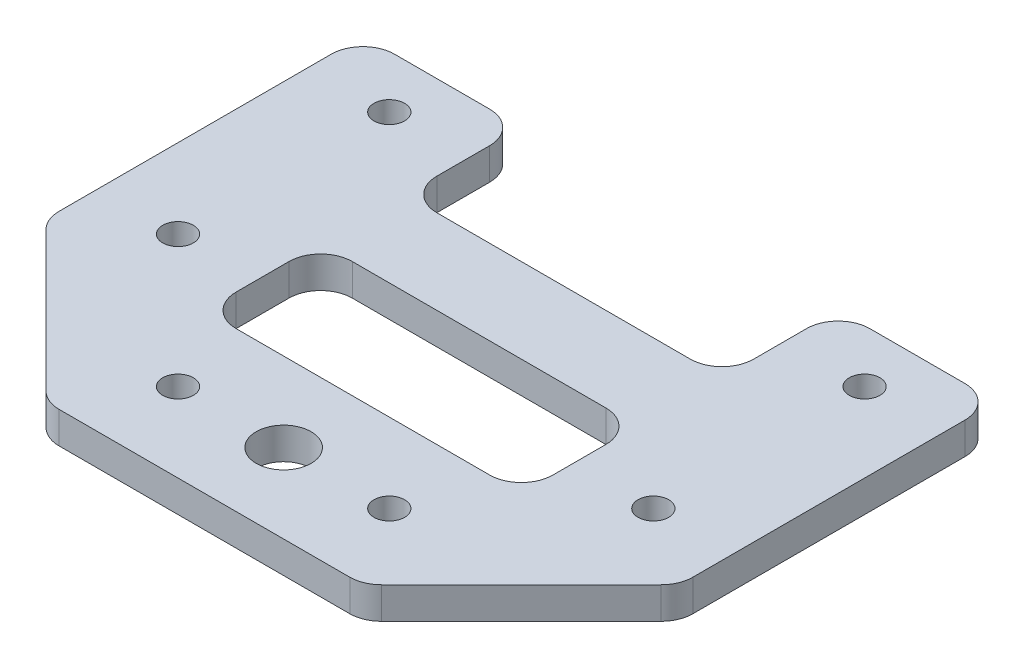
ISO-10303-21;
HEADER;
FILE_DESCRIPTION(('STEP AP214'),'2;1');
FILE_NAME('part.step','',(''),(''),'','','');
FILE_SCHEMA(('AUTOMOTIVE_DESIGN { 1 0 10303 214 1 1 1 1 }'));
ENDSEC;
DATA;
#1=APPLICATION_CONTEXT('core data for automotive mechanical design processes');
#2=APPLICATION_PROTOCOL_DEFINITION('international standard','automotive_design',2000,#1);
#3=PRODUCT_CONTEXT('',#1,'mechanical');
#4=PRODUCT('Part','Part','',(#3));
#5=PRODUCT_RELATED_PRODUCT_CATEGORY('part','',(#4));
#6=PRODUCT_DEFINITION_FORMATION('','',#4);
#7=PRODUCT_DEFINITION_CONTEXT('part definition',#1,'design');
#8=PRODUCT_DEFINITION('design','',#6,#7);
#9=PRODUCT_DEFINITION_SHAPE('','',#8);
#10=(LENGTH_UNIT() NAMED_UNIT(*) SI_UNIT(.MILLI.,.METRE.));
#11=(NAMED_UNIT(*) PLANE_ANGLE_UNIT() SI_UNIT($,.RADIAN.));
#12=(NAMED_UNIT(*) SI_UNIT($,.STERADIAN.) SOLID_ANGLE_UNIT());
#13=UNCERTAINTY_MEASURE_WITH_UNIT(LENGTH_MEASURE(1.E-05),#10,'distance_accuracy_value','');
#14=(GEOMETRIC_REPRESENTATION_CONTEXT(3) GLOBAL_UNCERTAINTY_ASSIGNED_CONTEXT((#13)) GLOBAL_UNIT_ASSIGNED_CONTEXT((#10,
#11,#12)) REPRESENTATION_CONTEXT('',''));
#15=CARTESIAN_POINT('',(0.,0.,0.));
#16=DIRECTION('',(0.,0.,1.));
#17=DIRECTION('',(1.,0.,0.));
#18=AXIS2_PLACEMENT_3D('',#15,#16,#17);
#19=CARTESIAN_POINT('',(0.,3.,0.));
#20=DIRECTION('',(0.,-1.,0.));
#21=DIRECTION('',(0.,0.,-1.));
#22=AXIS2_PLACEMENT_3D('',#19,#20,#21);
#23=PLANE('',#22);
#24=DIRECTION('',(1.,0.,0.));
#25=VECTOR('',#24,1.);
#26=CARTESIAN_POINT('',(0.,3.,15.));
#27=LINE('',#26,#25);
#28=CARTESIAN_POINT('',(-12.,3.,15.));
#29=VERTEX_POINT('',#28);
#30=CARTESIAN_POINT('',(12.,3.,15.));
#31=VERTEX_POINT('',#30);
#32=EDGE_CURVE('E560',#29,#31,#27,.T.);
#33=ORIENTED_EDGE('',*,*,#32,.F.);
#34=CARTESIAN_POINT('',(-12.,3.,12.));
#35=DIRECTION('',(0.,-1.,0.));
#36=DIRECTION('',(0.,0.,-1.));
#37=AXIS2_PLACEMENT_3D('',#34,#35,#36);
#38=CIRCLE('',#37,3.);
#39=CARTESIAN_POINT('',(-15.,3.,12.));
#40=VERTEX_POINT('',#39);
#41=EDGE_CURVE('E240',#29,#40,#38,.T.);
#42=ORIENTED_EDGE('',*,*,#41,.T.);
#43=DIRECTION('',(0.,0.,-1.));
#44=VECTOR('',#43,1.);
#45=CARTESIAN_POINT('',(-15.,3.,-15.));
#46=LINE('',#45,#44);
#47=CARTESIAN_POINT('',(-15.,3.,7.));
#48=VERTEX_POINT('',#47);
#49=EDGE_CURVE('E405',#40,#48,#46,.T.);
#50=ORIENTED_EDGE('',*,*,#49,.T.);
#51=CARTESIAN_POINT('',(-12.,3.,7.));
#52=DIRECTION('',(0.,-1.,0.));
#53=DIRECTION('',(0.,0.,-1.));
#54=AXIS2_PLACEMENT_3D('',#51,#52,#53);
#55=CIRCLE('',#54,3.);
#56=CARTESIAN_POINT('',(-12.,3.,4.));
#57=VERTEX_POINT('',#56);
#58=EDGE_CURVE('E370',#48,#57,#55,.T.);
#59=ORIENTED_EDGE('',*,*,#58,.T.);
#60=DIRECTION('',(1.,0.,0.));
#61=VECTOR('',#60,1.);
#62=CARTESIAN_POINT('',(-15.,3.,4.));
#63=LINE('',#62,#61);
#64=CARTESIAN_POINT('',(12.,3.,4.));
#65=VERTEX_POINT('',#64);
#66=EDGE_CURVE('E236',#57,#65,#63,.T.);
#67=ORIENTED_EDGE('',*,*,#66,.T.);
#68=CARTESIAN_POINT('',(12.,3.,7.));
#69=DIRECTION('',(0.,-1.,0.));
#70=DIRECTION('',(0.,0.,-1.));
#71=AXIS2_PLACEMENT_3D('',#68,#69,#70);
#72=CIRCLE('',#71,3.);
#73=CARTESIAN_POINT('',(15.,3.,7.));
#74=VERTEX_POINT('',#73);
#75=EDGE_CURVE('E230',#65,#74,#72,.T.);
#76=ORIENTED_EDGE('',*,*,#75,.T.);
#77=DIRECTION('',(0.,0.,1.));
#78=VECTOR('',#77,1.);
#79=CARTESIAN_POINT('',(15.,3.,-15.));
#80=LINE('',#79,#78);
#81=CARTESIAN_POINT('',(15.,3.,12.));
#82=VERTEX_POINT('',#81);
#83=EDGE_CURVE('E234',#74,#82,#80,.T.);
#84=ORIENTED_EDGE('',*,*,#83,.T.);
#85=CARTESIAN_POINT('',(12.,3.,12.));
#86=DIRECTION('',(0.,-1.,0.));
#87=DIRECTION('',(0.,0.,-1.));
#88=AXIS2_PLACEMENT_3D('',#85,#86,#87);
#89=CIRCLE('',#88,3.);
#90=EDGE_CURVE('E360',#82,#31,#89,.T.);
#91=ORIENTED_EDGE('',*,*,#90,.T.);
#92=EDGE_LOOP('',(#33,#42,#50,#59,#67,#76,#84,#91));
#93=FACE_BOUND('',#92,.T.);
#94=DIRECTION('',(-0.707106781186556,0.,-0.707106781186539));
#95=VECTOR('',#94,1.);
#96=CARTESIAN_POINT('',(-30.,3.,15.));
#97=LINE('',#96,#95);
#98=CARTESIAN_POINT('',(-15.87867965644,3.,29.1213203435597));
#99=VERTEX_POINT('',#98);
#100=CARTESIAN_POINT('',(-29.1213203435596,3.,15.8786796564404));
#101=VERTEX_POINT('',#100);
#102=EDGE_CURVE('E590',#99,#101,#97,.T.);
#103=ORIENTED_EDGE('',*,*,#102,.F.);
#104=CARTESIAN_POINT('',(-13.7573593128804,3.,27.));
#105=DIRECTION('',(0.,-1.,0.));
#106=DIRECTION('',(0.,0.,-1.));
#107=AXIS2_PLACEMENT_3D('',#104,#105,#106);
#108=CIRCLE('',#107,3.);
#109=CARTESIAN_POINT('',(-13.7573593128804,3.,30.));
#110=VERTEX_POINT('',#109);
#111=EDGE_CURVE('E299',#99,#110,#108,.F.);
#112=ORIENTED_EDGE('',*,*,#111,.T.);
#113=DIRECTION('',(1.,0.,0.));
#114=VECTOR('',#113,1.);
#115=CARTESIAN_POINT('',(0.,3.,30.));
#116=LINE('',#115,#114);
#117=CARTESIAN_POINT('',(13.7573593128804,3.,30.));
#118=VERTEX_POINT('',#117);
#119=EDGE_CURVE('E556',#110,#118,#116,.T.);
#120=ORIENTED_EDGE('',*,*,#119,.T.);
#121=CARTESIAN_POINT('',(13.7573593128804,3.,27.));
#122=DIRECTION('',(0.,-1.,0.));
#123=DIRECTION('',(0.,0.,-1.));
#124=AXIS2_PLACEMENT_3D('',#121,#122,#123);
#125=CIRCLE('',#124,3.);
#126=CARTESIAN_POINT('',(15.87867965644,3.,29.1213203435597));
#127=VERTEX_POINT('',#126);
#128=EDGE_CURVE('E297',#118,#127,#125,.F.);
#129=ORIENTED_EDGE('',*,*,#128,.T.);
#130=DIRECTION('',(-0.707106781186556,0.,0.707106781186539));
#131=VECTOR('',#130,1.);
#132=CARTESIAN_POINT('',(30.,3.,15.));
#133=LINE('',#132,#131);
#134=CARTESIAN_POINT('',(29.1213203435596,3.,15.8786796564403));
#135=VERTEX_POINT('',#134);
#136=EDGE_CURVE('E588',#135,#127,#133,.T.);
#137=ORIENTED_EDGE('',*,*,#136,.F.);
#138=CARTESIAN_POINT('',(27.,3.,13.7573593128807));
#139=DIRECTION('',(0.,-1.,0.));
#140=DIRECTION('',(0.,0.,-1.));
#141=AXIS2_PLACEMENT_3D('',#138,#139,#140);
#142=CIRCLE('',#141,3.);
#143=CARTESIAN_POINT('',(30.,3.,13.7573593128807));
#144=VERTEX_POINT('',#143);
#145=EDGE_CURVE('E295',#135,#144,#142,.F.);
#146=ORIENTED_EDGE('',*,*,#145,.T.);
#147=DIRECTION('',(0.,0.,-1.));
#148=VECTOR('',#147,1.);
#149=CARTESIAN_POINT('',(30.,3.,-15.));
#150=LINE('',#149,#148);
#151=CARTESIAN_POINT('',(30.,3.,-12.));
#152=VERTEX_POINT('',#151);
#153=EDGE_CURVE('E535',#144,#152,#150,.T.);
#154=ORIENTED_EDGE('',*,*,#153,.T.);
#155=CARTESIAN_POINT('',(27.,3.,-12.));
#156=DIRECTION('',(0.,-1.,0.));
#157=DIRECTION('',(0.,0.,-1.));
#158=AXIS2_PLACEMENT_3D('',#155,#156,#157);
#159=CIRCLE('',#158,3.);
#160=CARTESIAN_POINT('',(27.,3.,-15.));
#161=VERTEX_POINT('',#160);
#162=EDGE_CURVE('E293',#152,#161,#159,.F.);
#163=ORIENTED_EDGE('',*,*,#162,.T.);
#164=DIRECTION('',(-1.,0.,0.));
#165=VECTOR('',#164,1.);
#166=CARTESIAN_POINT('',(15.,3.,-15.));
#167=LINE('',#166,#165);
#168=CARTESIAN_POINT('',(18.,3.,-15.));
#169=VERTEX_POINT('',#168);
#170=EDGE_CURVE('E531',#161,#169,#167,.T.);
#171=ORIENTED_EDGE('',*,*,#170,.T.);
#172=CARTESIAN_POINT('',(18.,3.,-12.));
#173=DIRECTION('',(0.,-1.,0.));
#174=DIRECTION('',(0.,0.,-1.));
#175=AXIS2_PLACEMENT_3D('',#172,#173,#174);
#176=CIRCLE('',#175,3.);
#177=CARTESIAN_POINT('',(15.,3.,-12.));
#178=VERTEX_POINT('',#177);
#179=EDGE_CURVE('E291',#169,#178,#176,.F.);
#180=ORIENTED_EDGE('',*,*,#179,.T.);
#181=CARTESIAN_POINT('',(15.,3.,-7.));
#182=VERTEX_POINT('',#181);
#183=EDGE_CURVE('E252',#178,#182,#80,.T.);
#184=ORIENTED_EDGE('',*,*,#183,.T.);
#185=CARTESIAN_POINT('',(12.,3.,-7.));
#186=DIRECTION('',(0.,-1.,0.));
#187=DIRECTION('',(0.,0.,-1.));
#188=AXIS2_PLACEMENT_3D('',#185,#186,#187);
#189=CIRCLE('',#188,3.);
#190=CARTESIAN_POINT('',(12.,3.,-4.));
#191=VERTEX_POINT('',#190);
#192=EDGE_CURVE('E374',#182,#191,#189,.T.);
#193=ORIENTED_EDGE('',*,*,#192,.T.);
#194=DIRECTION('',(-1.,0.,0.));
#195=VECTOR('',#194,1.);
#196=CARTESIAN_POINT('',(-15.,3.,-4.));
#197=LINE('',#196,#195);
#198=CARTESIAN_POINT('',(-12.,3.,-4.));
#199=VERTEX_POINT('',#198);
#200=EDGE_CURVE('E393',#191,#199,#197,.T.);
#201=ORIENTED_EDGE('',*,*,#200,.T.);
#202=CARTESIAN_POINT('',(-12.,3.,-7.));
#203=DIRECTION('',(0.,-1.,0.));
#204=DIRECTION('',(0.,0.,-1.));
#205=AXIS2_PLACEMENT_3D('',#202,#203,#204);
#206=CIRCLE('',#205,3.);
#207=CARTESIAN_POINT('',(-15.,3.,-7.));
#208=VERTEX_POINT('',#207);
#209=EDGE_CURVE('E11',#199,#208,#206,.T.);
#210=ORIENTED_EDGE('',*,*,#209,.T.);
#211=CARTESIAN_POINT('',(-15.,3.,-12.));
#212=VERTEX_POINT('',#211);
#213=EDGE_CURVE('E401',#208,#212,#46,.T.);
#214=ORIENTED_EDGE('',*,*,#213,.T.);
#215=CARTESIAN_POINT('',(-18.,3.,-12.));
#216=DIRECTION('',(0.,-1.,0.));
#217=DIRECTION('',(0.,0.,-1.));
#218=AXIS2_PLACEMENT_3D('',#215,#216,#217);
#219=CIRCLE('',#218,3.);
#220=CARTESIAN_POINT('',(-18.,3.,-15.));
#221=VERTEX_POINT('',#220);
#222=EDGE_CURVE('E289',#212,#221,#219,.F.);
#223=ORIENTED_EDGE('',*,*,#222,.T.);
#224=DIRECTION('',(-1.,0.,0.));
#225=VECTOR('',#224,1.);
#226=CARTESIAN_POINT('',(-15.,3.,-15.));
#227=LINE('',#226,#225);
#228=CARTESIAN_POINT('',(-27.,3.,-15.));
#229=VERTEX_POINT('',#228);
#230=EDGE_CURVE('E406',#221,#229,#227,.T.);
#231=ORIENTED_EDGE('',*,*,#230,.T.);
#232=CARTESIAN_POINT('',(-27.,3.,-12.));
#233=DIRECTION('',(0.,-1.,0.));
#234=DIRECTION('',(0.,0.,-1.));
#235=AXIS2_PLACEMENT_3D('',#232,#233,#234);
#236=CIRCLE('',#235,3.);
#237=CARTESIAN_POINT('',(-30.,3.,-12.));
#238=VERTEX_POINT('',#237);
#239=EDGE_CURVE('E287',#229,#238,#236,.F.);
#240=ORIENTED_EDGE('',*,*,#239,.T.);
#241=DIRECTION('',(0.,0.,1.));
#242=VECTOR('',#241,1.);
#243=CARTESIAN_POINT('',(-30.,3.,-15.));
#244=LINE('',#243,#242);
#245=CARTESIAN_POINT('',(-30.,3.,13.7573593128807));
#246=VERTEX_POINT('',#245);
#247=EDGE_CURVE('E411',#238,#246,#244,.T.);
#248=ORIENTED_EDGE('',*,*,#247,.T.);
#249=CARTESIAN_POINT('',(-27.,3.,13.7573593128807));
#250=DIRECTION('',(0.,-1.,0.));
#251=DIRECTION('',(0.,0.,-1.));
#252=AXIS2_PLACEMENT_3D('',#249,#250,#251);
#253=CIRCLE('',#252,3.);
#254=EDGE_CURVE('E285',#246,#101,#253,.F.);
#255=ORIENTED_EDGE('',*,*,#254,.T.);
#256=EDGE_LOOP('',(#103,#112,#120,#129,#137,#146,#154,#163,#171,#180,#184,#193,#201,#210,#214,
#223,#231,#240,#248,#255));
#257=FACE_BOUND('',#256,.T.);
#258=CARTESIAN_POINT('',(-22.5,3.,10.));
#259=DIRECTION('',(0.,1.,0.));
#260=DIRECTION('',(0.,0.,1.));
#261=AXIS2_PLACEMENT_3D('',#258,#259,#260);
#262=CIRCLE('',#261,1.45);
#263=CARTESIAN_POINT('',(-22.5,3.,11.45));
#264=VERTEX_POINT('',#263);
#265=EDGE_CURVE('E427',#264,#264,#262,.T.);
#266=ORIENTED_EDGE('',*,*,#265,.F.);
#267=EDGE_LOOP('',(#266));
#268=FACE_BOUND('',#267,.T.);
#269=CARTESIAN_POINT('',(-22.5,3.,-10.));
#270=DIRECTION('',(0.,1.,0.));
#271=DIRECTION('',(0.,0.,1.));
#272=AXIS2_PLACEMENT_3D('',#269,#270,#271);
#273=CIRCLE('',#272,1.45);
#274=CARTESIAN_POINT('',(-22.5,3.,-8.55));
#275=VERTEX_POINT('',#274);
#276=EDGE_CURVE('E423',#275,#275,#273,.T.);
#277=ORIENTED_EDGE('',*,*,#276,.F.);
#278=EDGE_LOOP('',(#277));
#279=FACE_BOUND('',#278,.T.);
#280=CARTESIAN_POINT('',(22.5,3.,-10.));
#281=DIRECTION('',(0.,1.,0.));
#282=DIRECTION('',(0.,0.,-1.));
#283=AXIS2_PLACEMENT_3D('',#280,#281,#282);
#284=CIRCLE('',#283,1.45);
#285=CARTESIAN_POINT('',(22.5,3.,-11.45));
#286=VERTEX_POINT('',#285);
#287=EDGE_CURVE('E429',#286,#286,#284,.T.);
#288=ORIENTED_EDGE('',*,*,#287,.F.);
#289=EDGE_LOOP('',(#288));
#290=FACE_BOUND('',#289,.T.);
#291=CARTESIAN_POINT('',(22.5,3.,9.99999999999999));
#292=DIRECTION('',(0.,1.,0.));
#293=DIRECTION('',(0.,0.,-1.));
#294=AXIS2_PLACEMENT_3D('',#291,#292,#293);
#295=CIRCLE('',#294,1.45);
#296=CARTESIAN_POINT('',(22.5,3.,8.55));
#297=VERTEX_POINT('',#296);
#298=EDGE_CURVE('E544',#297,#297,#295,.T.);
#299=ORIENTED_EDGE('',*,*,#298,.F.);
#300=EDGE_LOOP('',(#299));
#301=FACE_BOUND('',#300,.T.);
#302=CARTESIAN_POINT('',(0.,3.,22.5));
#303=DIRECTION('',(0.,1.,0.));
#304=DIRECTION('',(0.,0.,1.));
#305=AXIS2_PLACEMENT_3D('',#302,#303,#304);
#306=CIRCLE('',#305,2.6);
#307=CARTESIAN_POINT('',(0.,3.,25.1));
#308=VERTEX_POINT('',#307);
#309=EDGE_CURVE('E569',#308,#308,#306,.T.);
#310=ORIENTED_EDGE('',*,*,#309,.F.);
#311=EDGE_LOOP('',(#310));
#312=FACE_BOUND('',#311,.T.);
#313=CARTESIAN_POINT('',(10.,3.,22.5));
#314=DIRECTION('',(0.,1.,0.));
#315=DIRECTION('',(0.,0.,1.));
#316=AXIS2_PLACEMENT_3D('',#313,#314,#315);
#317=CIRCLE('',#316,1.45);
#318=CARTESIAN_POINT('',(10.,3.,23.95));
#319=VERTEX_POINT('',#318);
#320=EDGE_CURVE('E566',#319,#319,#317,.T.);
#321=ORIENTED_EDGE('',*,*,#320,.F.);
#322=EDGE_LOOP('',(#321));
#323=FACE_BOUND('',#322,.T.);
#324=CARTESIAN_POINT('',(-10.,3.,22.5));
#325=DIRECTION('',(0.,1.,0.));
#326=DIRECTION('',(0.,0.,1.));
#327=AXIS2_PLACEMENT_3D('',#324,#325,#326);
#328=CIRCLE('',#327,1.45);
#329=CARTESIAN_POINT('',(-10.,3.,23.95));
#330=VERTEX_POINT('',#329);
#331=EDGE_CURVE('E563',#330,#330,#328,.T.);
#332=ORIENTED_EDGE('',*,*,#331,.F.);
#333=EDGE_LOOP('',(#332));
#334=FACE_BOUND('',#333,.T.);
#335=ADVANCED_FACE('F43',(#93,#257,#268,#279,#290,#301,#312,#323,#334),#23,.F.);
#336=CARTESIAN_POINT('',(0.,0.,0.));
#337=DIRECTION('',(0.,-1.,0.));
#338=DIRECTION('',(0.,0.,-1.));
#339=AXIS2_PLACEMENT_3D('',#336,#337,#338);
#340=PLANE('',#339);
#341=DIRECTION('',(1.,0.,0.));
#342=VECTOR('',#341,1.);
#343=CARTESIAN_POINT('',(0.,0.,30.));
#344=LINE('',#343,#342);
#345=CARTESIAN_POINT('',(-13.7573593128804,0.,30.));
#346=VERTEX_POINT('',#345);
#347=CARTESIAN_POINT('',(13.7573593128804,0.,30.));
#348=VERTEX_POINT('',#347);
#349=EDGE_CURVE('E551',#346,#348,#344,.T.);
#350=ORIENTED_EDGE('',*,*,#349,.F.);
#351=CARTESIAN_POINT('',(-13.7573593128804,0.,27.));
#352=DIRECTION('',(0.,-1.,0.));
#353=DIRECTION('',(0.,0.,-1.));
#354=AXIS2_PLACEMENT_3D('',#351,#352,#353);
#355=CIRCLE('',#354,3.);
#356=CARTESIAN_POINT('',(-15.87867965644,0.,29.1213203435597));
#357=VERTEX_POINT('',#356);
#358=EDGE_CURVE('E319',#346,#357,#355,.T.);
#359=ORIENTED_EDGE('',*,*,#358,.T.);
#360=DIRECTION('',(-0.707106781186556,0.,-0.707106781186539));
#361=VECTOR('',#360,1.);
#362=CARTESIAN_POINT('',(-30.,0.,15.));
#363=LINE('',#362,#361);
#364=CARTESIAN_POINT('',(-29.1213203435596,0.,15.8786796564404));
#365=VERTEX_POINT('',#364);
#366=EDGE_CURVE('E572',#357,#365,#363,.T.);
#367=ORIENTED_EDGE('',*,*,#366,.T.);
#368=CARTESIAN_POINT('',(-27.,0.,13.7573593128807));
#369=DIRECTION('',(0.,-1.,0.));
#370=DIRECTION('',(0.,0.,-1.));
#371=AXIS2_PLACEMENT_3D('',#368,#369,#370);
#372=CIRCLE('',#371,3.);
#373=CARTESIAN_POINT('',(-30.,0.,13.7573593128807));
#374=VERTEX_POINT('',#373);
#375=EDGE_CURVE('E306',#365,#374,#372,.T.);
#376=ORIENTED_EDGE('',*,*,#375,.T.);
#377=DIRECTION('',(0.,0.,1.));
#378=VECTOR('',#377,1.);
#379=CARTESIAN_POINT('',(-30.,0.,-15.));
#380=LINE('',#379,#378);
#381=CARTESIAN_POINT('',(-30.,0.,-12.));
#382=VERTEX_POINT('',#381);
#383=EDGE_CURVE('E415',#382,#374,#380,.T.);
#384=ORIENTED_EDGE('',*,*,#383,.F.);
#385=CARTESIAN_POINT('',(-27.,0.,-12.));
#386=DIRECTION('',(0.,-1.,0.));
#387=DIRECTION('',(0.,0.,-1.));
#388=AXIS2_PLACEMENT_3D('',#385,#386,#387);
#389=CIRCLE('',#388,3.);
#390=CARTESIAN_POINT('',(-27.,0.,-15.));
#391=VERTEX_POINT('',#390);
#392=EDGE_CURVE('E308',#382,#391,#389,.T.);
#393=ORIENTED_EDGE('',*,*,#392,.T.);
#394=DIRECTION('',(-1.,0.,0.));
#395=VECTOR('',#394,1.);
#396=CARTESIAN_POINT('',(-15.,0.,-15.));
#397=LINE('',#396,#395);
#398=CARTESIAN_POINT('',(-18.,0.,-15.));
#399=VERTEX_POINT('',#398);
#400=EDGE_CURVE('E418',#399,#391,#397,.T.);
#401=ORIENTED_EDGE('',*,*,#400,.F.);
#402=CARTESIAN_POINT('',(-18.,0.,-12.));
#403=DIRECTION('',(0.,-1.,0.));
#404=DIRECTION('',(0.,0.,-1.));
#405=AXIS2_PLACEMENT_3D('',#402,#403,#404);
#406=CIRCLE('',#405,3.);
#407=CARTESIAN_POINT('',(-15.,0.,-12.));
#408=VERTEX_POINT('',#407);
#409=EDGE_CURVE('E310',#399,#408,#406,.T.);
#410=ORIENTED_EDGE('',*,*,#409,.T.);
#411=DIRECTION('',(0.,0.,-1.));
#412=VECTOR('',#411,1.);
#413=CARTESIAN_POINT('',(-15.,0.,-15.));
#414=LINE('',#413,#412);
#415=CARTESIAN_POINT('',(-15.,0.,-7.));
#416=VERTEX_POINT('',#415);
#417=EDGE_CURVE('E383',#416,#408,#414,.T.);
#418=ORIENTED_EDGE('',*,*,#417,.F.);
#419=CARTESIAN_POINT('',(-12.,0.,-7.));
#420=DIRECTION('',(0.,-1.,0.));
#421=DIRECTION('',(0.,0.,-1.));
#422=AXIS2_PLACEMENT_3D('',#419,#420,#421);
#423=CIRCLE('',#422,3.);
#424=CARTESIAN_POINT('',(-12.,0.,-4.));
#425=VERTEX_POINT('',#424);
#426=EDGE_CURVE('E51',#416,#425,#423,.F.);
#427=ORIENTED_EDGE('',*,*,#426,.T.);
#428=DIRECTION('',(-1.,0.,0.));
#429=VECTOR('',#428,1.);
#430=CARTESIAN_POINT('',(-15.,0.,-4.));
#431=LINE('',#430,#429);
#432=CARTESIAN_POINT('',(12.,0.,-4.));
#433=VERTEX_POINT('',#432);
#434=EDGE_CURVE('E381',#433,#425,#431,.T.);
#435=ORIENTED_EDGE('',*,*,#434,.F.);
#436=CARTESIAN_POINT('',(12.,0.,-7.));
#437=DIRECTION('',(0.,-1.,0.));
#438=DIRECTION('',(0.,0.,-1.));
#439=AXIS2_PLACEMENT_3D('',#436,#437,#438);
#440=CIRCLE('',#439,3.);
#441=CARTESIAN_POINT('',(15.,0.,-7.));
#442=VERTEX_POINT('',#441);
#443=EDGE_CURVE('E372',#433,#442,#440,.F.);
#444=ORIENTED_EDGE('',*,*,#443,.T.);
#445=DIRECTION('',(0.,0.,1.));
#446=VECTOR('',#445,1.);
#447=CARTESIAN_POINT('',(15.,0.,-15.));
#448=LINE('',#447,#446);
#449=CARTESIAN_POINT('',(15.,0.,-12.));
#450=VERTEX_POINT('',#449);
#451=EDGE_CURVE('E541',#450,#442,#448,.T.);
#452=ORIENTED_EDGE('',*,*,#451,.F.);
#453=CARTESIAN_POINT('',(18.,0.,-12.));
#454=DIRECTION('',(0.,-1.,0.));
#455=DIRECTION('',(0.,0.,-1.));
#456=AXIS2_PLACEMENT_3D('',#453,#454,#455);
#457=CIRCLE('',#456,3.);
#458=CARTESIAN_POINT('',(18.,0.,-15.));
#459=VERTEX_POINT('',#458);
#460=EDGE_CURVE('E312',#450,#459,#457,.T.);
#461=ORIENTED_EDGE('',*,*,#460,.T.);
#462=DIRECTION('',(-1.,0.,0.));
#463=VECTOR('',#462,1.);
#464=CARTESIAN_POINT('',(15.,0.,-15.));
#465=LINE('',#464,#463);
#466=CARTESIAN_POINT('',(27.,0.,-15.));
#467=VERTEX_POINT('',#466);
#468=EDGE_CURVE('E256',#467,#459,#465,.T.);
#469=ORIENTED_EDGE('',*,*,#468,.F.);
#470=CARTESIAN_POINT('',(27.,0.,-12.));
#471=DIRECTION('',(0.,-1.,0.));
#472=DIRECTION('',(0.,0.,-1.));
#473=AXIS2_PLACEMENT_3D('',#470,#471,#472);
#474=CIRCLE('',#473,3.);
#475=CARTESIAN_POINT('',(30.,0.,-12.));
#476=VERTEX_POINT('',#475);
#477=EDGE_CURVE('E314',#467,#476,#474,.T.);
#478=ORIENTED_EDGE('',*,*,#477,.T.);
#479=DIRECTION('',(0.,0.,-1.));
#480=VECTOR('',#479,1.);
#481=CARTESIAN_POINT('',(30.,0.,-15.));
#482=LINE('',#481,#480);
#483=CARTESIAN_POINT('',(30.,0.,13.7573593128807));
#484=VERTEX_POINT('',#483);
#485=EDGE_CURVE('E261',#484,#476,#482,.T.);
#486=ORIENTED_EDGE('',*,*,#485,.F.);
#487=CARTESIAN_POINT('',(27.,0.,13.7573593128807));
#488=DIRECTION('',(0.,-1.,0.));
#489=DIRECTION('',(0.,0.,-1.));
#490=AXIS2_PLACEMENT_3D('',#487,#488,#489);
#491=CIRCLE('',#490,3.);
#492=CARTESIAN_POINT('',(29.1213203435596,0.,15.8786796564403));
#493=VERTEX_POINT('',#492);
#494=EDGE_CURVE('E65',#484,#493,#491,.T.);
#495=ORIENTED_EDGE('',*,*,#494,.T.);
#496=DIRECTION('',(-0.707106781186556,0.,0.707106781186539));
#497=VECTOR('',#496,1.);
#498=CARTESIAN_POINT('',(30.,0.,15.));
#499=LINE('',#498,#497);
#500=CARTESIAN_POINT('',(15.87867965644,0.,29.1213203435597));
#501=VERTEX_POINT('',#500);
#502=EDGE_CURVE('E586',#493,#501,#499,.T.);
#503=ORIENTED_EDGE('',*,*,#502,.T.);
#504=CARTESIAN_POINT('',(13.7573593128804,0.,27.));
#505=DIRECTION('',(0.,-1.,0.));
#506=DIRECTION('',(0.,0.,-1.));
#507=AXIS2_PLACEMENT_3D('',#504,#505,#506);
#508=CIRCLE('',#507,3.);
#509=EDGE_CURVE('E317',#501,#348,#508,.T.);
#510=ORIENTED_EDGE('',*,*,#509,.T.);
#511=EDGE_LOOP('',(#350,#359,#367,#376,#384,#393,#401,#410,#418,#427,#435,#444,#452,#461,#469,
#478,#486,#495,#503,#510));
#512=FACE_BOUND('',#511,.T.);
#513=CARTESIAN_POINT('',(-15.,0.,12.));
#514=VERTEX_POINT('',#513);
#515=CARTESIAN_POINT('',(-15.,0.,7.));
#516=VERTEX_POINT('',#515);
#517=EDGE_CURVE('E422',#514,#516,#414,.T.);
#518=ORIENTED_EDGE('',*,*,#517,.F.);
#519=CARTESIAN_POINT('',(-12.,0.,12.));
#520=DIRECTION('',(0.,-1.,0.));
#521=DIRECTION('',(0.,0.,-1.));
#522=AXIS2_PLACEMENT_3D('',#519,#520,#521);
#523=CIRCLE('',#522,3.);
#524=CARTESIAN_POINT('',(-12.,0.,15.));
#525=VERTEX_POINT('',#524);
#526=EDGE_CURVE('E366',#514,#525,#523,.F.);
#527=ORIENTED_EDGE('',*,*,#526,.T.);
#528=DIRECTION('',(1.,0.,0.));
#529=VECTOR('',#528,1.);
#530=CARTESIAN_POINT('',(0.,0.,15.));
#531=LINE('',#530,#529);
#532=CARTESIAN_POINT('',(12.,0.,15.));
#533=VERTEX_POINT('',#532);
#534=EDGE_CURVE('E575',#525,#533,#531,.T.);
#535=ORIENTED_EDGE('',*,*,#534,.T.);
#536=CARTESIAN_POINT('',(12.,0.,12.));
#537=DIRECTION('',(0.,-1.,0.));
#538=DIRECTION('',(0.,0.,-1.));
#539=AXIS2_PLACEMENT_3D('',#536,#537,#538);
#540=CIRCLE('',#539,3.);
#541=CARTESIAN_POINT('',(15.,0.,12.));
#542=VERTEX_POINT('',#541);
#543=EDGE_CURVE('E362',#533,#542,#540,.F.);
#544=ORIENTED_EDGE('',*,*,#543,.T.);
#545=CARTESIAN_POINT('',(15.,0.,7.));
#546=VERTEX_POINT('',#545);
#547=EDGE_CURVE('E534',#546,#542,#448,.T.);
#548=ORIENTED_EDGE('',*,*,#547,.F.);
#549=CARTESIAN_POINT('',(12.,0.,7.));
#550=DIRECTION('',(0.,-1.,0.));
#551=DIRECTION('',(0.,0.,-1.));
#552=AXIS2_PLACEMENT_3D('',#549,#550,#551);
#553=CIRCLE('',#552,3.);
#554=CARTESIAN_POINT('',(12.,0.,4.));
#555=VERTEX_POINT('',#554);
#556=EDGE_CURVE('E241',#546,#555,#553,.F.);
#557=ORIENTED_EDGE('',*,*,#556,.T.);
#558=DIRECTION('',(1.,0.,0.));
#559=VECTOR('',#558,1.);
#560=CARTESIAN_POINT('',(-15.,0.,4.));
#561=LINE('',#560,#559);
#562=CARTESIAN_POINT('',(-12.,0.,4.));
#563=VERTEX_POINT('',#562);
#564=EDGE_CURVE('E392',#563,#555,#561,.T.);
#565=ORIENTED_EDGE('',*,*,#564,.F.);
#566=CARTESIAN_POINT('',(-12.,0.,7.));
#567=DIRECTION('',(0.,-1.,0.));
#568=DIRECTION('',(0.,0.,-1.));
#569=AXIS2_PLACEMENT_3D('',#566,#567,#568);
#570=CIRCLE('',#569,3.);
#571=EDGE_CURVE('E368',#563,#516,#570,.F.);
#572=ORIENTED_EDGE('',*,*,#571,.T.);
#573=EDGE_LOOP('',(#518,#527,#535,#544,#548,#557,#565,#572));
#574=FACE_BOUND('',#573,.T.);
#575=CARTESIAN_POINT('',(-22.5,0.,10.));
#576=DIRECTION('',(0.,1.,0.));
#577=DIRECTION('',(0.,0.,1.));
#578=AXIS2_PLACEMENT_3D('',#575,#576,#577);
#579=CIRCLE('',#578,1.45);
#580=CARTESIAN_POINT('',(-22.5,0.,11.45));
#581=VERTEX_POINT('',#580);
#582=EDGE_CURVE('E264',#581,#581,#579,.T.);
#583=ORIENTED_EDGE('',*,*,#582,.T.);
#584=EDGE_LOOP('',(#583));
#585=FACE_BOUND('',#584,.T.);
#586=CARTESIAN_POINT('',(-22.5,0.,-10.));
#587=DIRECTION('',(0.,1.,0.));
#588=DIRECTION('',(0.,0.,1.));
#589=AXIS2_PLACEMENT_3D('',#586,#587,#588);
#590=CIRCLE('',#589,1.45);
#591=CARTESIAN_POINT('',(-22.5,0.,-8.55));
#592=VERTEX_POINT('',#591);
#593=EDGE_CURVE('E409',#592,#592,#590,.T.);
#594=ORIENTED_EDGE('',*,*,#593,.T.);
#595=EDGE_LOOP('',(#594));
#596=FACE_BOUND('',#595,.T.);
#597=CARTESIAN_POINT('',(22.5,0.,-10.));
#598=DIRECTION('',(0.,1.,0.));
#599=DIRECTION('',(0.,0.,-1.));
#600=AXIS2_PLACEMENT_3D('',#597,#598,#599);
#601=CIRCLE('',#600,1.45);
#602=CARTESIAN_POINT('',(22.5,0.,-11.45));
#603=VERTEX_POINT('',#602);
#604=EDGE_CURVE('E433',#603,#603,#601,.T.);
#605=ORIENTED_EDGE('',*,*,#604,.T.);
#606=EDGE_LOOP('',(#605));
#607=FACE_BOUND('',#606,.T.);
#608=CARTESIAN_POINT('',(22.5,0.,9.99999999999999));
#609=DIRECTION('',(0.,1.,0.));
#610=DIRECTION('',(0.,0.,-1.));
#611=AXIS2_PLACEMENT_3D('',#608,#609,#610);
#612=CIRCLE('',#611,1.45);
#613=CARTESIAN_POINT('',(22.5,0.,8.55));
#614=VERTEX_POINT('',#613);
#615=EDGE_CURVE('E253',#614,#614,#612,.T.);
#616=ORIENTED_EDGE('',*,*,#615,.T.);
#617=EDGE_LOOP('',(#616));
#618=FACE_BOUND('',#617,.T.);
#619=CARTESIAN_POINT('',(0.,0.,22.5));
#620=DIRECTION('',(0.,1.,0.));
#621=DIRECTION('',(0.,0.,1.));
#622=AXIS2_PLACEMENT_3D('',#619,#620,#621);
#623=CIRCLE('',#622,2.6);
#624=CARTESIAN_POINT('',(0.,0.,25.1));
#625=VERTEX_POINT('',#624);
#626=EDGE_CURVE('E559',#625,#625,#623,.T.);
#627=ORIENTED_EDGE('',*,*,#626,.T.);
#628=EDGE_LOOP('',(#627));
#629=FACE_BOUND('',#628,.T.);
#630=CARTESIAN_POINT('',(10.,0.,22.5));
#631=DIRECTION('',(0.,1.,0.));
#632=DIRECTION('',(0.,0.,1.));
#633=AXIS2_PLACEMENT_3D('',#630,#631,#632);
#634=CIRCLE('',#633,1.45);
#635=CARTESIAN_POINT('',(10.,0.,23.95));
#636=VERTEX_POINT('',#635);
#637=EDGE_CURVE('E581',#636,#636,#634,.T.);
#638=ORIENTED_EDGE('',*,*,#637,.T.);
#639=EDGE_LOOP('',(#638));
#640=FACE_BOUND('',#639,.T.);
#641=CARTESIAN_POINT('',(-10.,0.,22.5));
#642=DIRECTION('',(0.,1.,0.));
#643=DIRECTION('',(0.,0.,1.));
#644=AXIS2_PLACEMENT_3D('',#641,#642,#643);
#645=CIRCLE('',#644,1.45);
#646=CARTESIAN_POINT('',(-10.,0.,23.95));
#647=VERTEX_POINT('',#646);
#648=EDGE_CURVE('E578',#647,#647,#645,.T.);
#649=ORIENTED_EDGE('',*,*,#648,.T.);
#650=EDGE_LOOP('',(#649));
#651=FACE_BOUND('',#650,.T.);
#652=ADVANCED_FACE('F379',(#512,#574,#585,#596,#607,#618,#629,#640,#651),#340,.T.);
#653=CARTESIAN_POINT('',(-15.,0.,-15.));
#654=DIRECTION('',(1.,0.,0.));
#655=DIRECTION('',(0.,0.,-1.));
#656=AXIS2_PLACEMENT_3D('',#653,#654,#655);
#657=PLANE('',#656);
#658=ORIENTED_EDGE('',*,*,#49,.F.);
#659=DIRECTION('',(0.,1.,0.));
#660=VECTOR('',#659,1.);
#661=CARTESIAN_POINT('',(-15.,0.,12.));
#662=LINE('',#661,#660);
#663=EDGE_CURVE('E278',#40,#514,#662,.F.);
#664=ORIENTED_EDGE('',*,*,#663,.T.);
#665=ORIENTED_EDGE('',*,*,#517,.T.);
#666=DIRECTION('',(0.,-1.,0.));
#667=VECTOR('',#666,1.);
#668=CARTESIAN_POINT('',(-15.,0.,7.));
#669=LINE('',#668,#667);
#670=EDGE_CURVE('E276',#516,#48,#669,.F.);
#671=ORIENTED_EDGE('',*,*,#670,.T.);
#672=EDGE_LOOP('',(#658,#664,#665,#671));
#673=FACE_BOUND('',#672,.T.);
#674=ADVANCED_FACE('F461',(#673),#657,.T.);
#675=ORIENTED_EDGE('',*,*,#213,.F.);
#676=DIRECTION('',(0.,-1.,0.));
#677=VECTOR('',#676,1.);
#678=CARTESIAN_POINT('',(-15.,0.,-7.));
#679=LINE('',#678,#677);
#680=EDGE_CURVE('E347',#208,#416,#679,.T.);
#681=ORIENTED_EDGE('',*,*,#680,.T.);
#682=ORIENTED_EDGE('',*,*,#417,.T.);
#683=DIRECTION('',(0.,1.,0.));
#684=VECTOR('',#683,1.);
#685=CARTESIAN_POINT('',(-15.,0.,-12.));
#686=LINE('',#685,#684);
#687=EDGE_CURVE('E344',#408,#212,#686,.T.);
#688=ORIENTED_EDGE('',*,*,#687,.T.);
#689=EDGE_LOOP('',(#675,#681,#682,#688));
#690=FACE_BOUND('',#689,.T.);
#691=ADVANCED_FACE('F403',(#690),#657,.T.);
#692=CARTESIAN_POINT('',(-30.,0.,-15.));
#693=DIRECTION('',(-1.,0.,0.));
#694=DIRECTION('',(0.,0.,1.));
#695=AXIS2_PLACEMENT_3D('',#692,#693,#694);
#696=PLANE('',#695);
#697=ORIENTED_EDGE('',*,*,#247,.F.);
#698=DIRECTION('',(0.,1.,0.));
#699=VECTOR('',#698,1.);
#700=CARTESIAN_POINT('',(-30.,0.,-12.));
#701=LINE('',#700,#699);
#702=EDGE_CURVE('E358',#238,#382,#701,.F.);
#703=ORIENTED_EDGE('',*,*,#702,.T.);
#704=ORIENTED_EDGE('',*,*,#383,.T.);
#705=DIRECTION('',(0.,1.,0.));
#706=VECTOR('',#705,1.);
#707=CARTESIAN_POINT('',(-30.,3.,13.7573593128807));
#708=LINE('',#707,#706);
#709=EDGE_CURVE('E355',#374,#246,#708,.T.);
#710=ORIENTED_EDGE('',*,*,#709,.T.);
#711=EDGE_LOOP('',(#697,#703,#704,#710));
#712=FACE_BOUND('',#711,.T.);
#713=ADVANCED_FACE('F527',(#712),#696,.T.);
#714=CARTESIAN_POINT('',(-15.,0.,-15.));
#715=DIRECTION('',(0.,0.,-1.));
#716=DIRECTION('',(-1.,0.,0.));
#717=AXIS2_PLACEMENT_3D('',#714,#715,#716);
#718=PLANE('',#717);
#719=ORIENTED_EDGE('',*,*,#230,.F.);
#720=DIRECTION('',(0.,1.,0.));
#721=VECTOR('',#720,1.);
#722=CARTESIAN_POINT('',(-18.,0.,-15.));
#723=LINE('',#722,#721);
#724=EDGE_CURVE('E353',#221,#399,#723,.F.);
#725=ORIENTED_EDGE('',*,*,#724,.T.);
#726=ORIENTED_EDGE('',*,*,#400,.T.);
#727=DIRECTION('',(0.,1.,0.));
#728=VECTOR('',#727,1.);
#729=CARTESIAN_POINT('',(-27.,0.,-15.));
#730=LINE('',#729,#728);
#731=EDGE_CURVE('E350',#391,#229,#730,.T.);
#732=ORIENTED_EDGE('',*,*,#731,.T.);
#733=EDGE_LOOP('',(#719,#725,#726,#732));
#734=FACE_BOUND('',#733,.T.);
#735=ADVANCED_FACE('F452',(#734),#718,.T.);
#736=CARTESIAN_POINT('',(-22.5,0.,-10.));
#737=DIRECTION('',(0.,1.,0.));
#738=DIRECTION('',(0.,0.,1.));
#739=AXIS2_PLACEMENT_3D('',#736,#737,#738);
#740=CYLINDRICAL_SURFACE('',#739,1.45);
#741=ORIENTED_EDGE('',*,*,#593,.F.);
#742=EDGE_LOOP('',(#741));
#743=FACE_BOUND('',#742,.T.);
#744=ORIENTED_EDGE('',*,*,#276,.T.);
#745=EDGE_LOOP('',(#744));
#746=FACE_BOUND('',#745,.T.);
#747=ADVANCED_FACE('F443',(#743,#746),#740,.F.);
#748=CARTESIAN_POINT('',(-22.5,0.,10.));
#749=DIRECTION('',(0.,1.,0.));
#750=DIRECTION('',(0.,0.,1.));
#751=AXIS2_PLACEMENT_3D('',#748,#749,#750);
#752=CYLINDRICAL_SURFACE('',#751,1.45);
#753=ORIENTED_EDGE('',*,*,#582,.F.);
#754=EDGE_LOOP('',(#753));
#755=FACE_BOUND('',#754,.T.);
#756=ORIENTED_EDGE('',*,*,#265,.T.);
#757=EDGE_LOOP('',(#756));
#758=FACE_BOUND('',#757,.T.);
#759=ADVANCED_FACE('F440',(#755,#758),#752,.F.);
#760=CARTESIAN_POINT('',(15.,0.,-15.));
#761=DIRECTION('',(-1.,0.,0.));
#762=DIRECTION('',(0.,0.,1.));
#763=AXIS2_PLACEMENT_3D('',#760,#761,#762);
#764=PLANE('',#763);
#765=ORIENTED_EDGE('',*,*,#183,.F.);
#766=DIRECTION('',(0.,1.,0.));
#767=VECTOR('',#766,1.);
#768=CARTESIAN_POINT('',(15.,0.,-12.));
#769=LINE('',#768,#767);
#770=EDGE_CURVE('E337',#178,#450,#769,.F.);
#771=ORIENTED_EDGE('',*,*,#770,.T.);
#772=ORIENTED_EDGE('',*,*,#451,.T.);
#773=DIRECTION('',(0.,-1.,0.));
#774=VECTOR('',#773,1.);
#775=CARTESIAN_POINT('',(15.,0.,-7.));
#776=LINE('',#775,#774);
#777=EDGE_CURVE('E335',#442,#182,#776,.F.);
#778=ORIENTED_EDGE('',*,*,#777,.T.);
#779=EDGE_LOOP('',(#765,#771,#772,#778));
#780=FACE_BOUND('',#779,.T.);
#781=ADVANCED_FACE('F442',(#780),#764,.T.);
#782=ORIENTED_EDGE('',*,*,#547,.T.);
#783=DIRECTION('',(0.,1.,0.));
#784=VECTOR('',#783,1.);
#785=CARTESIAN_POINT('',(15.,0.,12.));
#786=LINE('',#785,#784);
#787=EDGE_CURVE('E251',#542,#82,#786,.T.);
#788=ORIENTED_EDGE('',*,*,#787,.T.);
#789=ORIENTED_EDGE('',*,*,#83,.F.);
#790=DIRECTION('',(0.,-1.,0.));
#791=VECTOR('',#790,1.);
#792=CARTESIAN_POINT('',(15.,0.,7.));
#793=LINE('',#792,#791);
#794=EDGE_CURVE('E248',#74,#546,#793,.T.);
#795=ORIENTED_EDGE('',*,*,#794,.T.);
#796=EDGE_LOOP('',(#782,#788,#789,#795));
#797=FACE_BOUND('',#796,.T.);
#798=ADVANCED_FACE('F247',(#797),#764,.T.);
#799=CARTESIAN_POINT('',(15.,0.,-15.));
#800=DIRECTION('',(0.,0.,-1.));
#801=DIRECTION('',(-1.,0.,0.));
#802=AXIS2_PLACEMENT_3D('',#799,#800,#801);
#803=PLANE('',#802);
#804=ORIENTED_EDGE('',*,*,#170,.F.);
#805=DIRECTION('',(0.,1.,0.));
#806=VECTOR('',#805,1.);
#807=CARTESIAN_POINT('',(27.,0.,-15.));
#808=LINE('',#807,#806);
#809=EDGE_CURVE('E333',#161,#467,#808,.F.);
#810=ORIENTED_EDGE('',*,*,#809,.T.);
#811=ORIENTED_EDGE('',*,*,#468,.T.);
#812=DIRECTION('',(0.,1.,0.));
#813=VECTOR('',#812,1.);
#814=CARTESIAN_POINT('',(18.,0.,-15.));
#815=LINE('',#814,#813);
#816=EDGE_CURVE('E330',#459,#169,#815,.T.);
#817=ORIENTED_EDGE('',*,*,#816,.T.);
#818=EDGE_LOOP('',(#804,#810,#811,#817));
#819=FACE_BOUND('',#818,.T.);
#820=ADVANCED_FACE('F618',(#819),#803,.T.);
#821=CARTESIAN_POINT('',(30.,0.,-15.));
#822=DIRECTION('',(1.,0.,0.));
#823=DIRECTION('',(0.,0.,-1.));
#824=AXIS2_PLACEMENT_3D('',#821,#822,#823);
#825=PLANE('',#824);
#826=ORIENTED_EDGE('',*,*,#153,.F.);
#827=DIRECTION('',(0.,1.,0.));
#828=VECTOR('',#827,1.);
#829=CARTESIAN_POINT('',(30.,0.,13.7573593128807));
#830=LINE('',#829,#828);
#831=EDGE_CURVE('E328',#144,#484,#830,.F.);
#832=ORIENTED_EDGE('',*,*,#831,.T.);
#833=ORIENTED_EDGE('',*,*,#485,.T.);
#834=DIRECTION('',(0.,1.,0.));
#835=VECTOR('',#834,1.);
#836=CARTESIAN_POINT('',(30.,0.,-12.));
#837=LINE('',#836,#835);
#838=EDGE_CURVE('E325',#476,#152,#837,.T.);
#839=ORIENTED_EDGE('',*,*,#838,.T.);
#840=EDGE_LOOP('',(#826,#832,#833,#839));
#841=FACE_BOUND('',#840,.T.);
#842=ADVANCED_FACE('F612',(#841),#825,.T.);
#843=CARTESIAN_POINT('',(22.5,0.,9.99999999999999));
#844=DIRECTION('',(0.,1.,0.));
#845=DIRECTION('',(0.,0.,1.));
#846=AXIS2_PLACEMENT_3D('',#843,#844,#845);
#847=CYLINDRICAL_SURFACE('',#846,1.45);
#848=ORIENTED_EDGE('',*,*,#615,.F.);
#849=EDGE_LOOP('',(#848));
#850=FACE_BOUND('',#849,.T.);
#851=ORIENTED_EDGE('',*,*,#298,.T.);
#852=EDGE_LOOP('',(#851));
#853=FACE_BOUND('',#852,.T.);
#854=ADVANCED_FACE('F633',(#850,#853),#847,.F.);
#855=CARTESIAN_POINT('',(22.5,0.,-10.));
#856=DIRECTION('',(0.,1.,0.));
#857=DIRECTION('',(0.,0.,1.));
#858=AXIS2_PLACEMENT_3D('',#855,#856,#857);
#859=CYLINDRICAL_SURFACE('',#858,1.45);
#860=ORIENTED_EDGE('',*,*,#604,.F.);
#861=EDGE_LOOP('',(#860));
#862=FACE_BOUND('',#861,.T.);
#863=ORIENTED_EDGE('',*,*,#287,.T.);
#864=EDGE_LOOP('',(#863));
#865=FACE_BOUND('',#864,.T.);
#866=ADVANCED_FACE('F679',(#862,#865),#859,.F.);
#867=CARTESIAN_POINT('',(-15.,3.,4.));
#868=DIRECTION('',(0.,0.,-1.));
#869=DIRECTION('',(-1.,0.,0.));
#870=AXIS2_PLACEMENT_3D('',#867,#868,#869);
#871=PLANE('',#870);
#872=ORIENTED_EDGE('',*,*,#564,.T.);
#873=DIRECTION('',(0.,-1.,0.));
#874=VECTOR('',#873,1.);
#875=CARTESIAN_POINT('',(12.,3.,4.));
#876=LINE('',#875,#874);
#877=EDGE_CURVE('E274',#555,#65,#876,.F.);
#878=ORIENTED_EDGE('',*,*,#877,.T.);
#879=ORIENTED_EDGE('',*,*,#66,.F.);
#880=DIRECTION('',(0.,-1.,0.));
#881=VECTOR('',#880,1.);
#882=CARTESIAN_POINT('',(-12.,3.,4.));
#883=LINE('',#882,#881);
#884=EDGE_CURVE('E271',#57,#563,#883,.T.);
#885=ORIENTED_EDGE('',*,*,#884,.T.);
#886=EDGE_LOOP('',(#872,#878,#879,#885));
#887=FACE_BOUND('',#886,.T.);
#888=ADVANCED_FACE('F673',(#887),#871,.F.);
#889=CARTESIAN_POINT('',(-15.,3.,-4.));
#890=DIRECTION('',(0.,0.,1.));
#891=DIRECTION('',(1.,0.,0.));
#892=AXIS2_PLACEMENT_3D('',#889,#890,#891);
#893=PLANE('',#892);
#894=ORIENTED_EDGE('',*,*,#200,.F.);
#895=DIRECTION('',(0.,-1.,0.));
#896=VECTOR('',#895,1.);
#897=CARTESIAN_POINT('',(12.,3.,-4.));
#898=LINE('',#897,#896);
#899=EDGE_CURVE('E341',#191,#433,#898,.T.);
#900=ORIENTED_EDGE('',*,*,#899,.T.);
#901=ORIENTED_EDGE('',*,*,#434,.T.);
#902=DIRECTION('',(0.,-1.,0.));
#903=VECTOR('',#902,1.);
#904=CARTESIAN_POINT('',(-12.,3.,-4.));
#905=LINE('',#904,#903);
#906=EDGE_CURVE('E339',#425,#199,#905,.F.);
#907=ORIENTED_EDGE('',*,*,#906,.T.);
#908=EDGE_LOOP('',(#894,#900,#901,#907));
#909=FACE_BOUND('',#908,.T.);
#910=ADVANCED_FACE('F389',(#909),#893,.F.);
#911=CARTESIAN_POINT('',(0.,0.,30.));
#912=DIRECTION('',(0.,0.,1.));
#913=DIRECTION('',(1.,0.,0.));
#914=AXIS2_PLACEMENT_3D('',#911,#912,#913);
#915=PLANE('',#914);
#916=ORIENTED_EDGE('',*,*,#119,.F.);
#917=DIRECTION('',(0.,1.,0.));
#918=VECTOR('',#917,1.);
#919=CARTESIAN_POINT('',(-13.7573593128804,0.,30.));
#920=LINE('',#919,#918);
#921=EDGE_CURVE('E304',#110,#346,#920,.F.);
#922=ORIENTED_EDGE('',*,*,#921,.T.);
#923=ORIENTED_EDGE('',*,*,#349,.T.);
#924=DIRECTION('',(0.,1.,0.));
#925=VECTOR('',#924,1.);
#926=CARTESIAN_POINT('',(13.7573593128804,3.,30.));
#927=LINE('',#926,#925);
#928=EDGE_CURVE('E301',#348,#118,#927,.T.);
#929=ORIENTED_EDGE('',*,*,#928,.T.);
#930=EDGE_LOOP('',(#916,#922,#923,#929));
#931=FACE_BOUND('',#930,.T.);
#932=ADVANCED_FACE('F603',(#931),#915,.T.);
#933=CARTESIAN_POINT('',(-10.,0.,22.5));
#934=DIRECTION('',(0.,1.,0.));
#935=DIRECTION('',(0.,0.,1.));
#936=AXIS2_PLACEMENT_3D('',#933,#934,#935);
#937=CYLINDRICAL_SURFACE('',#936,1.45);
#938=ORIENTED_EDGE('',*,*,#648,.F.);
#939=EDGE_LOOP('',(#938));
#940=FACE_BOUND('',#939,.T.);
#941=ORIENTED_EDGE('',*,*,#331,.T.);
#942=EDGE_LOOP('',(#941));
#943=FACE_BOUND('',#942,.T.);
#944=ADVANCED_FACE('F774',(#940,#943),#937,.F.);
#945=CARTESIAN_POINT('',(10.,0.,22.5));
#946=DIRECTION('',(0.,1.,0.));
#947=DIRECTION('',(0.,0.,1.));
#948=AXIS2_PLACEMENT_3D('',#945,#946,#947);
#949=CYLINDRICAL_SURFACE('',#948,1.45);
#950=ORIENTED_EDGE('',*,*,#637,.F.);
#951=EDGE_LOOP('',(#950));
#952=FACE_BOUND('',#951,.T.);
#953=ORIENTED_EDGE('',*,*,#320,.T.);
#954=EDGE_LOOP('',(#953));
#955=FACE_BOUND('',#954,.T.);
#956=ADVANCED_FACE('F770',(#952,#955),#949,.F.);
#957=CARTESIAN_POINT('',(0.,0.,22.5));
#958=DIRECTION('',(0.,1.,0.));
#959=DIRECTION('',(0.,0.,1.));
#960=AXIS2_PLACEMENT_3D('',#957,#958,#959);
#961=CYLINDRICAL_SURFACE('',#960,2.6);
#962=ORIENTED_EDGE('',*,*,#626,.F.);
#963=EDGE_LOOP('',(#962));
#964=FACE_BOUND('',#963,.T.);
#965=ORIENTED_EDGE('',*,*,#309,.T.);
#966=EDGE_LOOP('',(#965));
#967=FACE_BOUND('',#966,.T.);
#968=ADVANCED_FACE('F767',(#964,#967),#961,.F.);
#969=CARTESIAN_POINT('',(0.,0.,15.));
#970=DIRECTION('',(0.,0.,1.));
#971=DIRECTION('',(1.,0.,0.));
#972=AXIS2_PLACEMENT_3D('',#969,#970,#971);
#973=PLANE('',#972);
#974=ORIENTED_EDGE('',*,*,#32,.T.);
#975=DIRECTION('',(0.,1.,0.));
#976=VECTOR('',#975,1.);
#977=CARTESIAN_POINT('',(12.,0.,15.));
#978=LINE('',#977,#976);
#979=EDGE_CURVE('E269',#31,#533,#978,.F.);
#980=ORIENTED_EDGE('',*,*,#979,.T.);
#981=ORIENTED_EDGE('',*,*,#534,.F.);
#982=DIRECTION('',(0.,1.,0.));
#983=VECTOR('',#982,1.);
#984=CARTESIAN_POINT('',(-12.,0.,15.));
#985=LINE('',#984,#983);
#986=EDGE_CURVE('E258',#525,#29,#985,.T.);
#987=ORIENTED_EDGE('',*,*,#986,.T.);
#988=EDGE_LOOP('',(#974,#980,#981,#987));
#989=FACE_BOUND('',#988,.T.);
#990=ADVANCED_FACE('F769',(#989),#973,.F.);
#991=CARTESIAN_POINT('',(30.,0.,15.));
#992=DIRECTION('',(-0.707106781186539,0.,-0.707106781186556));
#993=DIRECTION('',(-0.707106781186556,0.,0.707106781186539));
#994=AXIS2_PLACEMENT_3D('',#991,#992,#993);
#995=PLANE('',#994);
#996=ORIENTED_EDGE('',*,*,#136,.T.);
#997=DIRECTION('',(0.,1.,0.));
#998=VECTOR('',#997,1.);
#999=CARTESIAN_POINT('',(15.87867965644,0.,29.1213203435597));
#1000=LINE('',#999,#998);
#1001=EDGE_CURVE('E58',#127,#501,#1000,.F.);
#1002=ORIENTED_EDGE('',*,*,#1001,.T.);
#1003=ORIENTED_EDGE('',*,*,#502,.F.);
#1004=DIRECTION('',(0.,1.,0.));
#1005=VECTOR('',#1004,1.);
#1006=CARTESIAN_POINT('',(29.1213203435596,3.,15.8786796564403));
#1007=LINE('',#1006,#1005);
#1008=EDGE_CURVE('E321',#493,#135,#1007,.T.);
#1009=ORIENTED_EDGE('',*,*,#1008,.T.);
#1010=EDGE_LOOP('',(#996,#1002,#1003,#1009));
#1011=FACE_BOUND('',#1010,.T.);
#1012=ADVANCED_FACE('F607',(#1011),#995,.F.);
#1013=CARTESIAN_POINT('',(-30.,0.,15.));
#1014=DIRECTION('',(0.707106781186539,0.,-0.707106781186556));
#1015=DIRECTION('',(-0.707106781186556,0.,-0.707106781186539));
#1016=AXIS2_PLACEMENT_3D('',#1013,#1014,#1015);
#1017=PLANE('',#1016);
#1018=ORIENTED_EDGE('',*,*,#366,.F.);
#1019=DIRECTION('',(0.,1.,0.));
#1020=VECTOR('',#1019,1.);
#1021=CARTESIAN_POINT('',(-15.87867965644,3.,29.1213203435597));
#1022=LINE('',#1021,#1020);
#1023=EDGE_CURVE('E282',#357,#99,#1022,.T.);
#1024=ORIENTED_EDGE('',*,*,#1023,.T.);
#1025=ORIENTED_EDGE('',*,*,#102,.T.);
#1026=DIRECTION('',(0.,1.,0.));
#1027=VECTOR('',#1026,1.);
#1028=CARTESIAN_POINT('',(-29.1213203435596,0.,15.8786796564404));
#1029=LINE('',#1028,#1027);
#1030=EDGE_CURVE('E280',#101,#365,#1029,.F.);
#1031=ORIENTED_EDGE('',*,*,#1030,.T.);
#1032=EDGE_LOOP('',(#1018,#1024,#1025,#1031));
#1033=FACE_BOUND('',#1032,.T.);
#1034=ADVANCED_FACE('F467',(#1033),#1017,.F.);
#1035=CARTESIAN_POINT('',(12.,0.,12.));
#1036=DIRECTION('',(0.,1.,0.));
#1037=DIRECTION('',(0.,0.,1.));
#1038=AXIS2_PLACEMENT_3D('',#1035,#1036,#1037);
#1039=CYLINDRICAL_SURFACE('',#1038,3.);
#1040=ORIENTED_EDGE('',*,*,#543,.F.);
#1041=ORIENTED_EDGE('',*,*,#979,.F.);
#1042=ORIENTED_EDGE('',*,*,#90,.F.);
#1043=ORIENTED_EDGE('',*,*,#787,.F.);
#1044=EDGE_LOOP('',(#1040,#1041,#1042,#1043));
#1045=FACE_BOUND('',#1044,.T.);
#1046=ADVANCED_FACE('F464',(#1045),#1039,.F.);
#1047=CARTESIAN_POINT('',(12.,0.,7.));
#1048=DIRECTION('',(0.,-1.,0.));
#1049=DIRECTION('',(0.,0.,-1.));
#1050=AXIS2_PLACEMENT_3D('',#1047,#1048,#1049);
#1051=CYLINDRICAL_SURFACE('',#1050,3.);
#1052=ORIENTED_EDGE('',*,*,#75,.F.);
#1053=ORIENTED_EDGE('',*,*,#877,.F.);
#1054=ORIENTED_EDGE('',*,*,#556,.F.);
#1055=ORIENTED_EDGE('',*,*,#794,.F.);
#1056=EDGE_LOOP('',(#1052,#1053,#1054,#1055));
#1057=FACE_BOUND('',#1056,.T.);
#1058=ADVANCED_FACE('F255',(#1057),#1051,.F.);
#1059=CARTESIAN_POINT('',(-12.,0.,12.));
#1060=DIRECTION('',(0.,1.,0.));
#1061=DIRECTION('',(0.,0.,1.));
#1062=AXIS2_PLACEMENT_3D('',#1059,#1060,#1061);
#1063=CYLINDRICAL_SURFACE('',#1062,3.);
#1064=ORIENTED_EDGE('',*,*,#526,.F.);
#1065=ORIENTED_EDGE('',*,*,#663,.F.);
#1066=ORIENTED_EDGE('',*,*,#41,.F.);
#1067=ORIENTED_EDGE('',*,*,#986,.F.);
#1068=EDGE_LOOP('',(#1064,#1065,#1066,#1067));
#1069=FACE_BOUND('',#1068,.T.);
#1070=ADVANCED_FACE('F471',(#1069),#1063,.F.);
#1071=CARTESIAN_POINT('',(-12.,3.,7.));
#1072=DIRECTION('',(0.,-1.,0.));
#1073=DIRECTION('',(0.,0.,-1.));
#1074=AXIS2_PLACEMENT_3D('',#1071,#1072,#1073);
#1075=CYLINDRICAL_SURFACE('',#1074,3.);
#1076=ORIENTED_EDGE('',*,*,#58,.F.);
#1077=ORIENTED_EDGE('',*,*,#670,.F.);
#1078=ORIENTED_EDGE('',*,*,#571,.F.);
#1079=ORIENTED_EDGE('',*,*,#884,.F.);
#1080=EDGE_LOOP('',(#1076,#1077,#1078,#1079));
#1081=FACE_BOUND('',#1080,.T.);
#1082=ADVANCED_FACE('F474',(#1081),#1075,.F.);
#1083=CARTESIAN_POINT('',(-13.7573593128804,0.,27.));
#1084=DIRECTION('',(0.,-1.,0.));
#1085=DIRECTION('',(0.,0.,-1.));
#1086=AXIS2_PLACEMENT_3D('',#1083,#1084,#1085);
#1087=CYLINDRICAL_SURFACE('',#1086,3.);
#1088=ORIENTED_EDGE('',*,*,#358,.F.);
#1089=ORIENTED_EDGE('',*,*,#921,.F.);
#1090=ORIENTED_EDGE('',*,*,#111,.F.);
#1091=ORIENTED_EDGE('',*,*,#1023,.F.);
#1092=EDGE_LOOP('',(#1088,#1089,#1090,#1091));
#1093=FACE_BOUND('',#1092,.T.);
#1094=ADVANCED_FACE('F478',(#1093),#1087,.T.);
#1095=CARTESIAN_POINT('',(13.7573593128804,0.,27.));
#1096=DIRECTION('',(0.,-1.,0.));
#1097=DIRECTION('',(0.,0.,-1.));
#1098=AXIS2_PLACEMENT_3D('',#1095,#1096,#1097);
#1099=CYLINDRICAL_SURFACE('',#1098,3.);
#1100=ORIENTED_EDGE('',*,*,#509,.F.);
#1101=ORIENTED_EDGE('',*,*,#1001,.F.);
#1102=ORIENTED_EDGE('',*,*,#128,.F.);
#1103=ORIENTED_EDGE('',*,*,#928,.F.);
#1104=EDGE_LOOP('',(#1100,#1101,#1102,#1103));
#1105=FACE_BOUND('',#1104,.T.);
#1106=ADVANCED_FACE('F482',(#1105),#1099,.T.);
#1107=CARTESIAN_POINT('',(27.,0.,13.7573593128807));
#1108=DIRECTION('',(0.,-1.,0.));
#1109=DIRECTION('',(0.,0.,-1.));
#1110=AXIS2_PLACEMENT_3D('',#1107,#1108,#1109);
#1111=CYLINDRICAL_SURFACE('',#1110,3.);
#1112=ORIENTED_EDGE('',*,*,#494,.F.);
#1113=ORIENTED_EDGE('',*,*,#831,.F.);
#1114=ORIENTED_EDGE('',*,*,#145,.F.);
#1115=ORIENTED_EDGE('',*,*,#1008,.F.);
#1116=EDGE_LOOP('',(#1112,#1113,#1114,#1115));
#1117=FACE_BOUND('',#1116,.T.);
#1118=ADVANCED_FACE('F486',(#1117),#1111,.T.);
#1119=CARTESIAN_POINT('',(27.,0.,-12.));
#1120=DIRECTION('',(0.,1.,0.));
#1121=DIRECTION('',(0.,0.,1.));
#1122=AXIS2_PLACEMENT_3D('',#1119,#1120,#1121);
#1123=CYLINDRICAL_SURFACE('',#1122,3.);
#1124=ORIENTED_EDGE('',*,*,#477,.F.);
#1125=ORIENTED_EDGE('',*,*,#809,.F.);
#1126=ORIENTED_EDGE('',*,*,#162,.F.);
#1127=ORIENTED_EDGE('',*,*,#838,.F.);
#1128=EDGE_LOOP('',(#1124,#1125,#1126,#1127));
#1129=FACE_BOUND('',#1128,.T.);
#1130=ADVANCED_FACE('F490',(#1129),#1123,.T.);
#1131=CARTESIAN_POINT('',(18.,0.,-12.));
#1132=DIRECTION('',(0.,1.,0.));
#1133=DIRECTION('',(0.,0.,1.));
#1134=AXIS2_PLACEMENT_3D('',#1131,#1132,#1133);
#1135=CYLINDRICAL_SURFACE('',#1134,3.);
#1136=ORIENTED_EDGE('',*,*,#460,.F.);
#1137=ORIENTED_EDGE('',*,*,#770,.F.);
#1138=ORIENTED_EDGE('',*,*,#179,.F.);
#1139=ORIENTED_EDGE('',*,*,#816,.F.);
#1140=EDGE_LOOP('',(#1136,#1137,#1138,#1139));
#1141=FACE_BOUND('',#1140,.T.);
#1142=ADVANCED_FACE('F494',(#1141),#1135,.T.);
#1143=CARTESIAN_POINT('',(12.,3.,-7.));
#1144=DIRECTION('',(0.,-1.,0.));
#1145=DIRECTION('',(0.,0.,-1.));
#1146=AXIS2_PLACEMENT_3D('',#1143,#1144,#1145);
#1147=CYLINDRICAL_SURFACE('',#1146,3.);
#1148=ORIENTED_EDGE('',*,*,#192,.F.);
#1149=ORIENTED_EDGE('',*,*,#777,.F.);
#1150=ORIENTED_EDGE('',*,*,#443,.F.);
#1151=ORIENTED_EDGE('',*,*,#899,.F.);
#1152=EDGE_LOOP('',(#1148,#1149,#1150,#1151));
#1153=FACE_BOUND('',#1152,.T.);
#1154=ADVANCED_FACE('F498',(#1153),#1147,.F.);
#1155=CARTESIAN_POINT('',(-12.,0.,-7.));
#1156=DIRECTION('',(0.,-1.,0.));
#1157=DIRECTION('',(0.,0.,-1.));
#1158=AXIS2_PLACEMENT_3D('',#1155,#1156,#1157);
#1159=CYLINDRICAL_SURFACE('',#1158,3.);
#1160=ORIENTED_EDGE('',*,*,#209,.F.);
#1161=ORIENTED_EDGE('',*,*,#906,.F.);
#1162=ORIENTED_EDGE('',*,*,#426,.F.);
#1163=ORIENTED_EDGE('',*,*,#680,.F.);
#1164=EDGE_LOOP('',(#1160,#1161,#1162,#1163));
#1165=FACE_BOUND('',#1164,.T.);
#1166=ADVANCED_FACE('F396',(#1165),#1159,.F.);
#1167=CARTESIAN_POINT('',(-18.,0.,-12.));
#1168=DIRECTION('',(0.,1.,0.));
#1169=DIRECTION('',(0.,0.,1.));
#1170=AXIS2_PLACEMENT_3D('',#1167,#1168,#1169);
#1171=CYLINDRICAL_SURFACE('',#1170,3.);
#1172=ORIENTED_EDGE('',*,*,#409,.F.);
#1173=ORIENTED_EDGE('',*,*,#724,.F.);
#1174=ORIENTED_EDGE('',*,*,#222,.F.);
#1175=ORIENTED_EDGE('',*,*,#687,.F.);
#1176=EDGE_LOOP('',(#1172,#1173,#1174,#1175));
#1177=FACE_BOUND('',#1176,.T.);
#1178=ADVANCED_FACE('F505',(#1177),#1171,.T.);
#1179=CARTESIAN_POINT('',(-27.,0.,-12.));
#1180=DIRECTION('',(0.,1.,0.));
#1181=DIRECTION('',(0.,0.,1.));
#1182=AXIS2_PLACEMENT_3D('',#1179,#1180,#1181);
#1183=CYLINDRICAL_SURFACE('',#1182,3.);
#1184=ORIENTED_EDGE('',*,*,#392,.F.);
#1185=ORIENTED_EDGE('',*,*,#702,.F.);
#1186=ORIENTED_EDGE('',*,*,#239,.F.);
#1187=ORIENTED_EDGE('',*,*,#731,.F.);
#1188=EDGE_LOOP('',(#1184,#1185,#1186,#1187));
#1189=FACE_BOUND('',#1188,.T.);
#1190=ADVANCED_FACE('F507',(#1189),#1183,.T.);
#1191=CARTESIAN_POINT('',(-27.,0.,13.7573593128807));
#1192=DIRECTION('',(0.,-1.,0.));
#1193=DIRECTION('',(0.,0.,-1.));
#1194=AXIS2_PLACEMENT_3D('',#1191,#1192,#1193);
#1195=CYLINDRICAL_SURFACE('',#1194,3.);
#1196=ORIENTED_EDGE('',*,*,#375,.F.);
#1197=ORIENTED_EDGE('',*,*,#1030,.F.);
#1198=ORIENTED_EDGE('',*,*,#254,.F.);
#1199=ORIENTED_EDGE('',*,*,#709,.F.);
#1200=EDGE_LOOP('',(#1196,#1197,#1198,#1199));
#1201=FACE_BOUND('',#1200,.T.);
#1202=ADVANCED_FACE('F45',(#1201),#1195,.T.);
#1203=CLOSED_SHELL('',(#335,#652,#674,#691,#713,#735,#747,#759,#781,#798,#820,#842,#854,#866,
#888,#910,#932,#944,#956,#968,#990,#1012,#1034,#1046,#1058,#1070,#1082,#1094,#1106,#1118,#1130,
#1142,#1154,#1166,#1178,#1190,#1202));
#1204=MANIFOLD_SOLID_BREP('B2',#1203);
#1205=ADVANCED_BREP_SHAPE_REPRESENTATION('',(#18,#1204),#14);
#1206=SHAPE_DEFINITION_REPRESENTATION(#9,#1205);
ENDSEC;
END-ISO-10303-21;
